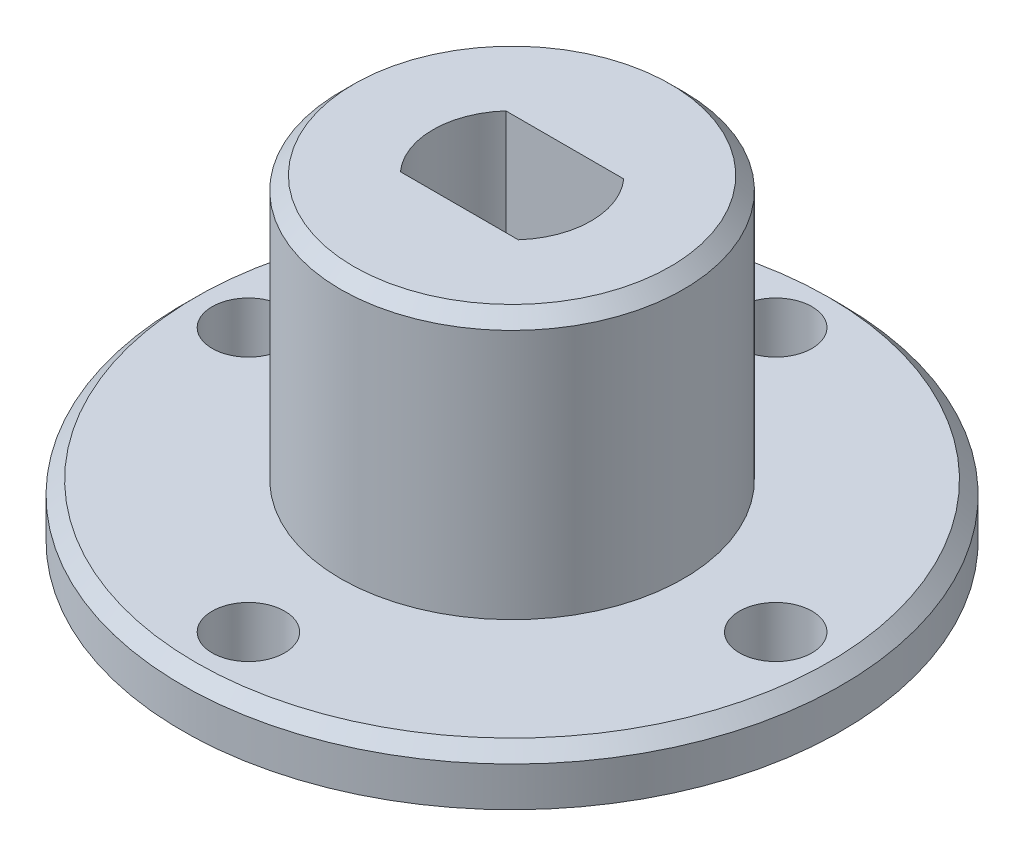
ISO-10303-21;
HEADER;
FILE_DESCRIPTION(('STEP AP214'),'2;1');
FILE_NAME('part.step','',(''),(''),'','','');
FILE_SCHEMA(('AUTOMOTIVE_DESIGN { 1 0 10303 214 1 1 1 1 }'));
ENDSEC;
DATA;
#1=APPLICATION_CONTEXT('core data for automotive mechanical design processes');
#2=APPLICATION_PROTOCOL_DEFINITION('international standard','automotive_design',2000,#1);
#3=PRODUCT_CONTEXT('',#1,'mechanical');
#4=PRODUCT('Part','Part','',(#3));
#5=PRODUCT_RELATED_PRODUCT_CATEGORY('part','',(#4));
#6=PRODUCT_DEFINITION_FORMATION('','',#4);
#7=PRODUCT_DEFINITION_CONTEXT('part definition',#1,'design');
#8=PRODUCT_DEFINITION('design','',#6,#7);
#9=PRODUCT_DEFINITION_SHAPE('','',#8);
#10=(LENGTH_UNIT() NAMED_UNIT(*) SI_UNIT(.MILLI.,.METRE.));
#11=(NAMED_UNIT(*) PLANE_ANGLE_UNIT() SI_UNIT($,.RADIAN.));
#12=(NAMED_UNIT(*) SI_UNIT($,.STERADIAN.) SOLID_ANGLE_UNIT());
#13=UNCERTAINTY_MEASURE_WITH_UNIT(LENGTH_MEASURE(1.E-05),#10,'distance_accuracy_value','');
#14=(GEOMETRIC_REPRESENTATION_CONTEXT(3) GLOBAL_UNCERTAINTY_ASSIGNED_CONTEXT((#13)) GLOBAL_UNIT_ASSIGNED_CONTEXT((#10,
#11,#12)) REPRESENTATION_CONTEXT('',''));
#15=CARTESIAN_POINT('',(0.,0.,0.));
#16=DIRECTION('',(0.,0.,1.));
#17=DIRECTION('',(1.,0.,0.));
#18=AXIS2_PLACEMENT_3D('',#15,#16,#17);
#19=CARTESIAN_POINT('',(0.,20.,0.));
#20=DIRECTION('',(0.,1.,0.));
#21=DIRECTION('',(0.,0.,1.));
#22=AXIS2_PLACEMENT_3D('',#19,#20,#21);
#23=PLANE('',#22);
#24=CARTESIAN_POINT('',(0.,20.,0.));
#25=DIRECTION('',(0.,1.,0.));
#26=DIRECTION('',(0.,0.,1.));
#27=AXIS2_PLACEMENT_3D('',#24,#25,#26);
#28=CIRCLE('',#27,12.);
#29=CARTESIAN_POINT('',(0.,20.,12.));
#30=VERTEX_POINT('',#29);
#31=EDGE_CURVE('E49',#30,#30,#28,.T.);
#32=ORIENTED_EDGE('',*,*,#31,.T.);
#33=EDGE_LOOP('',(#32));
#34=FACE_BOUND('',#33,.T.);
#35=DIRECTION('',(1.,0.,0.));
#36=VECTOR('',#35,1.);
#37=CARTESIAN_POINT('',(-4.47213595499958,20.,4.));
#38=LINE('',#37,#36);
#39=CARTESIAN_POINT('',(-4.47213595499958,20.,4.));
#40=VERTEX_POINT('',#39);
#41=CARTESIAN_POINT('',(4.47213595499958,20.,4.));
#42=VERTEX_POINT('',#41);
#43=EDGE_CURVE('E89',#40,#42,#38,.T.);
#44=ORIENTED_EDGE('',*,*,#43,.F.);
#45=CARTESIAN_POINT('',(0.,20.,0.));
#46=DIRECTION('',(0.,1.,0.));
#47=DIRECTION('',(0.,0.,1.));
#48=AXIS2_PLACEMENT_3D('',#45,#46,#47);
#49=CIRCLE('',#48,6.);
#50=CARTESIAN_POINT('',(-4.47213595499958,20.,-4.));
#51=VERTEX_POINT('',#50);
#52=EDGE_CURVE('E114',#51,#40,#49,.T.);
#53=ORIENTED_EDGE('',*,*,#52,.F.);
#54=DIRECTION('',(-1.,0.,0.));
#55=VECTOR('',#54,1.);
#56=CARTESIAN_POINT('',(-4.47213595499958,20.,-4.));
#57=LINE('',#56,#55);
#58=CARTESIAN_POINT('',(4.47213595499958,20.,-4.));
#59=VERTEX_POINT('',#58);
#60=EDGE_CURVE('E61',#59,#51,#57,.T.);
#61=ORIENTED_EDGE('',*,*,#60,.F.);
#62=CARTESIAN_POINT('',(0.,20.,0.));
#63=DIRECTION('',(0.,1.,0.));
#64=DIRECTION('',(0.,0.,1.));
#65=AXIS2_PLACEMENT_3D('',#62,#63,#64);
#66=CIRCLE('',#65,6.);
#67=EDGE_CURVE('E117',#42,#59,#66,.T.);
#68=ORIENTED_EDGE('',*,*,#67,.F.);
#69=EDGE_LOOP('',(#44,#53,#61,#68));
#70=FACE_BOUND('',#69,.T.);
#71=ADVANCED_FACE('F41',(#34,#70),#23,.T.);
#72=CARTESIAN_POINT('',(0.,20.,0.));
#73=DIRECTION('',(0.,-1.,0.));
#74=DIRECTION('',(0.,0.,-1.));
#75=AXIS2_PLACEMENT_3D('',#72,#73,#74);
#76=CYLINDRICAL_SURFACE('',#75,13.);
#77=CARTESIAN_POINT('',(0.,19.,0.));
#78=DIRECTION('',(0.,1.,0.));
#79=DIRECTION('',(0.,0.,1.));
#80=AXIS2_PLACEMENT_3D('',#77,#78,#79);
#81=CIRCLE('',#80,13.);
#82=CARTESIAN_POINT('',(0.,19.,13.));
#83=VERTEX_POINT('',#82);
#84=EDGE_CURVE('E11',#83,#83,#81,.F.);
#85=ORIENTED_EDGE('',*,*,#84,.T.);
#86=EDGE_LOOP('',(#85));
#87=FACE_BOUND('',#86,.T.);
#88=CARTESIAN_POINT('',(0.,0.,0.));
#89=DIRECTION('',(0.,1.,0.));
#90=DIRECTION('',(0.,0.,1.));
#91=AXIS2_PLACEMENT_3D('',#88,#89,#90);
#92=CIRCLE('',#91,13.);
#93=CARTESIAN_POINT('',(0.,0.,13.));
#94=VERTEX_POINT('',#93);
#95=EDGE_CURVE('E113',#94,#94,#92,.T.);
#96=ORIENTED_EDGE('',*,*,#95,.T.);
#97=EDGE_LOOP('',(#96));
#98=FACE_BOUND('',#97,.T.);
#99=ADVANCED_FACE('F158',(#87,#98),#76,.T.);
#100=CARTESIAN_POINT('',(0.,20.,0.));
#101=DIRECTION('',(0.,-1.,0.));
#102=DIRECTION('',(0.,0.,-1.));
#103=AXIS2_PLACEMENT_3D('',#100,#101,#102);
#104=CYLINDRICAL_SURFACE('',#103,6.);
#105=DIRECTION('',(0.,-1.,0.));
#106=VECTOR('',#105,1.);
#107=CARTESIAN_POINT('',(-4.47213595499958,20.,4.));
#108=LINE('',#107,#106);
#109=CARTESIAN_POINT('',(-4.47213595499958,-4.,4.));
#110=VERTEX_POINT('',#109);
#111=EDGE_CURVE('E92',#40,#110,#108,.T.);
#112=ORIENTED_EDGE('',*,*,#111,.T.);
#113=CARTESIAN_POINT('',(0.,-4.,0.));
#114=DIRECTION('',(0.,-1.,0.));
#115=DIRECTION('',(0.,0.,-1.));
#116=AXIS2_PLACEMENT_3D('',#113,#114,#115);
#117=CIRCLE('',#116,6.);
#118=CARTESIAN_POINT('',(-4.47213595499958,-4.,-4.));
#119=VERTEX_POINT('',#118);
#120=EDGE_CURVE('E103',#110,#119,#117,.T.);
#121=ORIENTED_EDGE('',*,*,#120,.T.);
#122=DIRECTION('',(0.,-1.,0.));
#123=VECTOR('',#122,1.);
#124=CARTESIAN_POINT('',(-4.47213595499958,20.,-4.));
#125=LINE('',#124,#123);
#126=EDGE_CURVE('E120',#51,#119,#125,.T.);
#127=ORIENTED_EDGE('',*,*,#126,.F.);
#128=ORIENTED_EDGE('',*,*,#52,.T.);
#129=EDGE_LOOP('',(#112,#121,#127,#128));
#130=FACE_BOUND('',#129,.T.);
#131=ADVANCED_FACE('F164',(#130),#104,.F.);
#132=CARTESIAN_POINT('',(-4.47213595499958,20.,4.));
#133=DIRECTION('',(0.,0.,-1.));
#134=DIRECTION('',(-1.,0.,0.));
#135=AXIS2_PLACEMENT_3D('',#132,#133,#134);
#136=PLANE('',#135);
#137=DIRECTION('',(0.,-1.,0.));
#138=VECTOR('',#137,1.);
#139=CARTESIAN_POINT('',(4.47213595499958,20.,4.));
#140=LINE('',#139,#138);
#141=CARTESIAN_POINT('',(4.47213595499958,-4.,4.));
#142=VERTEX_POINT('',#141);
#143=EDGE_CURVE('E81',#42,#142,#140,.T.);
#144=ORIENTED_EDGE('',*,*,#143,.T.);
#145=DIRECTION('',(-1.,0.,0.));
#146=VECTOR('',#145,1.);
#147=CARTESIAN_POINT('',(-4.47213595499958,-4.,4.));
#148=LINE('',#147,#146);
#149=EDGE_CURVE('E86',#142,#110,#148,.T.);
#150=ORIENTED_EDGE('',*,*,#149,.T.);
#151=ORIENTED_EDGE('',*,*,#111,.F.);
#152=ORIENTED_EDGE('',*,*,#43,.T.);
#153=EDGE_LOOP('',(#144,#150,#151,#152));
#154=FACE_BOUND('',#153,.T.);
#155=ADVANCED_FACE('F83',(#154),#136,.T.);
#156=CARTESIAN_POINT('',(0.,20.,0.));
#157=DIRECTION('',(0.,-1.,0.));
#158=DIRECTION('',(0.,0.,-1.));
#159=AXIS2_PLACEMENT_3D('',#156,#157,#158);
#160=CYLINDRICAL_SURFACE('',#159,6.);
#161=DIRECTION('',(0.,-1.,0.));
#162=VECTOR('',#161,1.);
#163=CARTESIAN_POINT('',(4.47213595499958,20.,-4.));
#164=LINE('',#163,#162);
#165=CARTESIAN_POINT('',(4.47213595499958,-4.,-4.));
#166=VERTEX_POINT('',#165);
#167=EDGE_CURVE('E56',#59,#166,#164,.T.);
#168=ORIENTED_EDGE('',*,*,#167,.T.);
#169=CARTESIAN_POINT('',(0.,-4.,0.));
#170=DIRECTION('',(0.,-1.,0.));
#171=DIRECTION('',(0.,0.,-1.));
#172=AXIS2_PLACEMENT_3D('',#169,#170,#171);
#173=CIRCLE('',#172,6.);
#174=EDGE_CURVE('E95',#166,#142,#173,.T.);
#175=ORIENTED_EDGE('',*,*,#174,.T.);
#176=ORIENTED_EDGE('',*,*,#143,.F.);
#177=ORIENTED_EDGE('',*,*,#67,.T.);
#178=EDGE_LOOP('',(#168,#175,#176,#177));
#179=FACE_BOUND('',#178,.T.);
#180=ADVANCED_FACE('F96',(#179),#160,.F.);
#181=CARTESIAN_POINT('',(-4.47213595499958,20.,-4.));
#182=DIRECTION('',(0.,0.,1.));
#183=DIRECTION('',(1.,0.,0.));
#184=AXIS2_PLACEMENT_3D('',#181,#182,#183);
#185=PLANE('',#184);
#186=ORIENTED_EDGE('',*,*,#126,.T.);
#187=DIRECTION('',(1.,0.,0.));
#188=VECTOR('',#187,1.);
#189=CARTESIAN_POINT('',(4.47213595499958,-4.,-4.));
#190=LINE('',#189,#188);
#191=EDGE_CURVE('E105',#119,#166,#190,.T.);
#192=ORIENTED_EDGE('',*,*,#191,.T.);
#193=ORIENTED_EDGE('',*,*,#167,.F.);
#194=ORIENTED_EDGE('',*,*,#60,.T.);
#195=EDGE_LOOP('',(#186,#192,#193,#194));
#196=FACE_BOUND('',#195,.T.);
#197=ADVANCED_FACE('F175',(#196),#185,.T.);
#198=CARTESIAN_POINT('',(0.,-4.,0.));
#199=DIRECTION('',(0.,-1.,0.));
#200=DIRECTION('',(0.,0.,-1.));
#201=AXIS2_PLACEMENT_3D('',#198,#199,#200);
#202=PLANE('',#201);
#203=CARTESIAN_POINT('',(0.,-4.,-20.));
#204=DIRECTION('',(0.,-1.,0.));
#205=DIRECTION('',(0.,0.,-1.));
#206=AXIS2_PLACEMENT_3D('',#203,#204,#205);
#207=CIRCLE('',#206,2.74999999999999);
#208=CARTESIAN_POINT('',(0.,-4.,-22.75));
#209=VERTEX_POINT('',#208);
#210=EDGE_CURVE('E138',#209,#209,#207,.T.);
#211=ORIENTED_EDGE('',*,*,#210,.F.);
#212=EDGE_LOOP('',(#211));
#213=FACE_BOUND('',#212,.T.);
#214=CARTESIAN_POINT('',(-20.,-4.,0.));
#215=DIRECTION('',(0.,-1.,0.));
#216=DIRECTION('',(0.,0.,-1.));
#217=AXIS2_PLACEMENT_3D('',#214,#215,#216);
#218=CIRCLE('',#217,2.74999999999999);
#219=CARTESIAN_POINT('',(-20.,-4.,-2.74999999999999));
#220=VERTEX_POINT('',#219);
#221=EDGE_CURVE('E134',#220,#220,#218,.T.);
#222=ORIENTED_EDGE('',*,*,#221,.F.);
#223=EDGE_LOOP('',(#222));
#224=FACE_BOUND('',#223,.T.);
#225=CARTESIAN_POINT('',(0.,-4.,20.));
#226=DIRECTION('',(0.,-1.,0.));
#227=DIRECTION('',(0.,0.,-1.));
#228=AXIS2_PLACEMENT_3D('',#225,#226,#227);
#229=CIRCLE('',#228,2.74999999999999);
#230=CARTESIAN_POINT('',(0.,-4.,17.25));
#231=VERTEX_POINT('',#230);
#232=EDGE_CURVE('E133',#231,#231,#229,.T.);
#233=ORIENTED_EDGE('',*,*,#232,.F.);
#234=EDGE_LOOP('',(#233));
#235=FACE_BOUND('',#234,.T.);
#236=CARTESIAN_POINT('',(20.,-4.,0.));
#237=DIRECTION('',(0.,-1.,0.));
#238=DIRECTION('',(0.,0.,-1.));
#239=AXIS2_PLACEMENT_3D('',#236,#237,#238);
#240=CIRCLE('',#239,2.74999999999999);
#241=CARTESIAN_POINT('',(20.,-4.,-2.74999999999999));
#242=VERTEX_POINT('',#241);
#243=EDGE_CURVE('E129',#242,#242,#240,.T.);
#244=ORIENTED_EDGE('',*,*,#243,.F.);
#245=EDGE_LOOP('',(#244));
#246=FACE_BOUND('',#245,.T.);
#247=CARTESIAN_POINT('',(0.,-4.,0.));
#248=DIRECTION('',(0.,-1.,0.));
#249=DIRECTION('',(0.,0.,-1.));
#250=AXIS2_PLACEMENT_3D('',#247,#248,#249);
#251=CIRCLE('',#250,25.);
#252=CARTESIAN_POINT('',(0.,-4.,-25.));
#253=VERTEX_POINT('',#252);
#254=EDGE_CURVE('E110',#253,#253,#251,.T.);
#255=ORIENTED_EDGE('',*,*,#254,.T.);
#256=EDGE_LOOP('',(#255));
#257=FACE_BOUND('',#256,.T.);
#258=ORIENTED_EDGE('',*,*,#149,.F.);
#259=ORIENTED_EDGE('',*,*,#174,.F.);
#260=ORIENTED_EDGE('',*,*,#191,.F.);
#261=ORIENTED_EDGE('',*,*,#120,.F.);
#262=EDGE_LOOP('',(#258,#259,#260,#261));
#263=FACE_BOUND('',#262,.T.);
#264=ADVANCED_FACE('F101',(#213,#224,#235,#246,#257,#263),#202,.T.);
#265=CARTESIAN_POINT('',(0.,0.,0.));
#266=DIRECTION('',(0.,-1.,0.));
#267=DIRECTION('',(0.,0.,-1.));
#268=AXIS2_PLACEMENT_3D('',#265,#266,#267);
#269=PLANE('',#268);
#270=CARTESIAN_POINT('',(0.,0.,0.));
#271=DIRECTION('',(0.,-1.,0.));
#272=DIRECTION('',(0.,0.,-1.));
#273=AXIS2_PLACEMENT_3D('',#270,#271,#272);
#274=CIRCLE('',#273,24.);
#275=CARTESIAN_POINT('',(0.,0.,-24.));
#276=VERTEX_POINT('',#275);
#277=EDGE_CURVE('E141',#276,#276,#274,.F.);
#278=ORIENTED_EDGE('',*,*,#277,.T.);
#279=EDGE_LOOP('',(#278));
#280=FACE_BOUND('',#279,.T.);
#281=CARTESIAN_POINT('',(0.,0.,-20.));
#282=DIRECTION('',(0.,-1.,0.));
#283=DIRECTION('',(0.,0.,-1.));
#284=AXIS2_PLACEMENT_3D('',#281,#282,#283);
#285=CIRCLE('',#284,2.74999999999999);
#286=CARTESIAN_POINT('',(0.,0.,-22.75));
#287=VERTEX_POINT('',#286);
#288=EDGE_CURVE('E135',#287,#287,#285,.T.);
#289=ORIENTED_EDGE('',*,*,#288,.T.);
#290=EDGE_LOOP('',(#289));
#291=FACE_BOUND('',#290,.T.);
#292=CARTESIAN_POINT('',(-20.,0.,0.));
#293=DIRECTION('',(0.,-1.,0.));
#294=DIRECTION('',(0.,0.,-1.));
#295=AXIS2_PLACEMENT_3D('',#292,#293,#294);
#296=CIRCLE('',#295,2.74999999999999);
#297=CARTESIAN_POINT('',(-20.,0.,-2.74999999999999));
#298=VERTEX_POINT('',#297);
#299=EDGE_CURVE('E130',#298,#298,#296,.T.);
#300=ORIENTED_EDGE('',*,*,#299,.T.);
#301=EDGE_LOOP('',(#300));
#302=FACE_BOUND('',#301,.T.);
#303=CARTESIAN_POINT('',(0.,0.,20.));
#304=DIRECTION('',(0.,-1.,0.));
#305=DIRECTION('',(0.,0.,-1.));
#306=AXIS2_PLACEMENT_3D('',#303,#304,#305);
#307=CIRCLE('',#306,2.74999999999999);
#308=CARTESIAN_POINT('',(0.,0.,17.25));
#309=VERTEX_POINT('',#308);
#310=EDGE_CURVE('E215',#309,#309,#307,.T.);
#311=ORIENTED_EDGE('',*,*,#310,.T.);
#312=EDGE_LOOP('',(#311));
#313=FACE_BOUND('',#312,.T.);
#314=CARTESIAN_POINT('',(20.,0.,0.));
#315=DIRECTION('',(0.,-1.,0.));
#316=DIRECTION('',(0.,0.,-1.));
#317=AXIS2_PLACEMENT_3D('',#314,#315,#316);
#318=CIRCLE('',#317,2.74999999999999);
#319=CARTESIAN_POINT('',(20.,0.,-2.74999999999999));
#320=VERTEX_POINT('',#319);
#321=EDGE_CURVE('E99',#320,#320,#318,.T.);
#322=ORIENTED_EDGE('',*,*,#321,.T.);
#323=EDGE_LOOP('',(#322));
#324=FACE_BOUND('',#323,.T.);
#325=ORIENTED_EDGE('',*,*,#95,.F.);
#326=EDGE_LOOP('',(#325));
#327=FACE_BOUND('',#326,.T.);
#328=ADVANCED_FACE('F182',(#280,#291,#302,#313,#324,#327),#269,.F.);
#329=CARTESIAN_POINT('',(0.,-4.,0.));
#330=DIRECTION('',(0.,1.,0.));
#331=DIRECTION('',(0.,0.,1.));
#332=AXIS2_PLACEMENT_3D('',#329,#330,#331);
#333=CYLINDRICAL_SURFACE('',#332,25.);
#334=CARTESIAN_POINT('',(0.,-1.,0.));
#335=DIRECTION('',(0.,-1.,0.));
#336=DIRECTION('',(0.,0.,-1.));
#337=AXIS2_PLACEMENT_3D('',#334,#335,#336);
#338=CIRCLE('',#337,25.);
#339=CARTESIAN_POINT('',(0.,-1.,-25.));
#340=VERTEX_POINT('',#339);
#341=EDGE_CURVE('E124',#340,#340,#338,.T.);
#342=ORIENTED_EDGE('',*,*,#341,.T.);
#343=EDGE_LOOP('',(#342));
#344=FACE_BOUND('',#343,.T.);
#345=ORIENTED_EDGE('',*,*,#254,.F.);
#346=EDGE_LOOP('',(#345));
#347=FACE_BOUND('',#346,.T.);
#348=ADVANCED_FACE('F178',(#344,#347),#333,.T.);
#349=CARTESIAN_POINT('',(20.,-4.,0.));
#350=DIRECTION('',(0.,-1.,0.));
#351=DIRECTION('',(0.,0.,-1.));
#352=AXIS2_PLACEMENT_3D('',#349,#350,#351);
#353=CYLINDRICAL_SURFACE('',#352,2.74999999999999);
#354=ORIENTED_EDGE('',*,*,#243,.T.);
#355=EDGE_LOOP('',(#354));
#356=FACE_BOUND('',#355,.T.);
#357=ORIENTED_EDGE('',*,*,#321,.F.);
#358=EDGE_LOOP('',(#357));
#359=FACE_BOUND('',#358,.T.);
#360=ADVANCED_FACE('F181',(#356,#359),#353,.F.);
#361=CARTESIAN_POINT('',(0.,-4.,20.));
#362=DIRECTION('',(0.,-1.,0.));
#363=DIRECTION('',(0.,0.,-1.));
#364=AXIS2_PLACEMENT_3D('',#361,#362,#363);
#365=CYLINDRICAL_SURFACE('',#364,2.74999999999999);
#366=ORIENTED_EDGE('',*,*,#232,.T.);
#367=EDGE_LOOP('',(#366));
#368=FACE_BOUND('',#367,.T.);
#369=ORIENTED_EDGE('',*,*,#310,.F.);
#370=EDGE_LOOP('',(#369));
#371=FACE_BOUND('',#370,.T.);
#372=ADVANCED_FACE('F192',(#368,#371),#365,.F.);
#373=CARTESIAN_POINT('',(-20.,-4.,0.));
#374=DIRECTION('',(0.,-1.,0.));
#375=DIRECTION('',(0.,0.,-1.));
#376=AXIS2_PLACEMENT_3D('',#373,#374,#375);
#377=CYLINDRICAL_SURFACE('',#376,2.74999999999999);
#378=ORIENTED_EDGE('',*,*,#221,.T.);
#379=EDGE_LOOP('',(#378));
#380=FACE_BOUND('',#379,.T.);
#381=ORIENTED_EDGE('',*,*,#299,.F.);
#382=EDGE_LOOP('',(#381));
#383=FACE_BOUND('',#382,.T.);
#384=ADVANCED_FACE('F196',(#380,#383),#377,.F.);
#385=CARTESIAN_POINT('',(0.,-4.,-20.));
#386=DIRECTION('',(0.,-1.,0.));
#387=DIRECTION('',(0.,0.,-1.));
#388=AXIS2_PLACEMENT_3D('',#385,#386,#387);
#389=CYLINDRICAL_SURFACE('',#388,2.74999999999999);
#390=ORIENTED_EDGE('',*,*,#210,.T.);
#391=EDGE_LOOP('',(#390));
#392=FACE_BOUND('',#391,.T.);
#393=ORIENTED_EDGE('',*,*,#288,.F.);
#394=EDGE_LOOP('',(#393));
#395=FACE_BOUND('',#394,.T.);
#396=ADVANCED_FACE('F154',(#392,#395),#389,.F.);
#397=CARTESIAN_POINT('',(0.,-1.,0.));
#398=DIRECTION('',(0.,-1.,0.));
#399=DIRECTION('',(0.,0.,-1.));
#400=AXIS2_PLACEMENT_3D('',#397,#398,#399);
#401=CONICAL_SURFACE('',#400,25.,0.785398163397452);
#402=ORIENTED_EDGE('',*,*,#277,.F.);
#403=EDGE_LOOP('',(#402));
#404=FACE_BOUND('',#403,.T.);
#405=ORIENTED_EDGE('',*,*,#341,.F.);
#406=EDGE_LOOP('',(#405));
#407=FACE_BOUND('',#406,.T.);
#408=ADVANCED_FACE('F149',(#404,#407),#401,.T.);
#409=CARTESIAN_POINT('',(0.,20.,0.));
#410=DIRECTION('',(0.,-1.,0.));
#411=DIRECTION('',(0.,0.,-1.));
#412=AXIS2_PLACEMENT_3D('',#409,#410,#411);
#413=CONICAL_SURFACE('',#412,12.,0.78539816339745);
#414=ORIENTED_EDGE('',*,*,#84,.F.);
#415=EDGE_LOOP('',(#414));
#416=FACE_BOUND('',#415,.T.);
#417=ORIENTED_EDGE('',*,*,#31,.F.);
#418=EDGE_LOOP('',(#417));
#419=FACE_BOUND('',#418,.T.);
#420=ADVANCED_FACE('F43',(#416,#419),#413,.T.);
#421=CLOSED_SHELL('',(#71,#99,#131,#155,#180,#197,#264,#328,#348,#360,#372,#384,#396,#408,#420));
#422=MANIFOLD_SOLID_BREP('B2',#421);
#423=ADVANCED_BREP_SHAPE_REPRESENTATION('',(#18,#422),#14);
#424=SHAPE_DEFINITION_REPRESENTATION(#9,#423);
ENDSEC;
END-ISO-10303-21;
